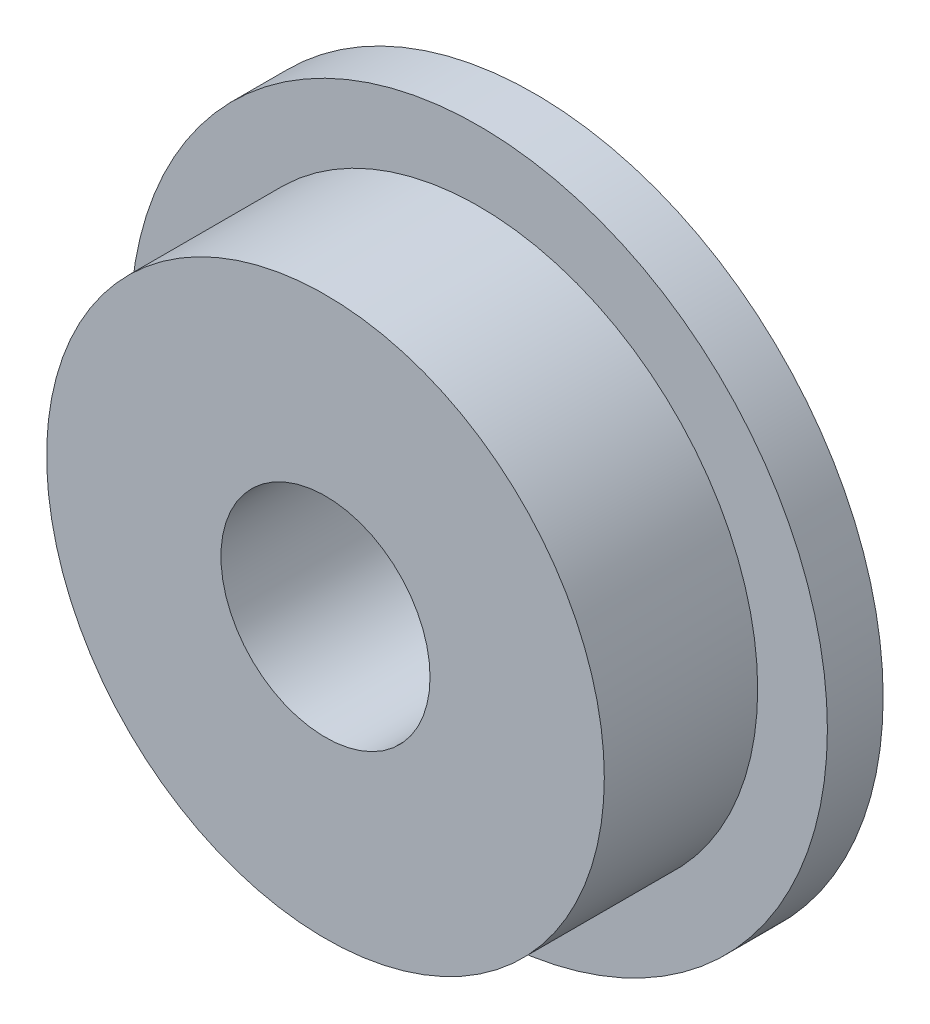
ISO-10303-21;
HEADER;
FILE_DESCRIPTION(('STEP AP214'),'2;1');
FILE_NAME('part.step','',(''),(''),'','','');
FILE_SCHEMA(('AUTOMOTIVE_DESIGN { 1 0 10303 214 1 1 1 1 }'));
ENDSEC;
DATA;
#1=APPLICATION_CONTEXT('core data for automotive mechanical design processes');
#2=APPLICATION_PROTOCOL_DEFINITION('international standard','automotive_design',2000,#1);
#3=PRODUCT_CONTEXT('',#1,'mechanical');
#4=PRODUCT('Part','Part','',(#3));
#5=PRODUCT_RELATED_PRODUCT_CATEGORY('part','',(#4));
#6=PRODUCT_DEFINITION_FORMATION('','',#4);
#7=PRODUCT_DEFINITION_CONTEXT('part definition',#1,'design');
#8=PRODUCT_DEFINITION('design','',#6,#7);
#9=PRODUCT_DEFINITION_SHAPE('','',#8);
#10=(LENGTH_UNIT() NAMED_UNIT(*) SI_UNIT(.MILLI.,.METRE.));
#11=(NAMED_UNIT(*) PLANE_ANGLE_UNIT() SI_UNIT($,.RADIAN.));
#12=(NAMED_UNIT(*) SI_UNIT($,.STERADIAN.) SOLID_ANGLE_UNIT());
#13=UNCERTAINTY_MEASURE_WITH_UNIT(LENGTH_MEASURE(1.E-05),#10,'distance_accuracy_value','');
#14=(GEOMETRIC_REPRESENTATION_CONTEXT(3) GLOBAL_UNCERTAINTY_ASSIGNED_CONTEXT((#13)) GLOBAL_UNIT_ASSIGNED_CONTEXT((#10,
#11,#12)) REPRESENTATION_CONTEXT('',''));
#15=CARTESIAN_POINT('',(0.,0.,0.));
#16=DIRECTION('',(0.,0.,1.));
#17=DIRECTION('',(1.,0.,0.));
#18=AXIS2_PLACEMENT_3D('',#15,#16,#17);
#19=CARTESIAN_POINT('',(0.,0.,0.4));
#20=DIRECTION('',(0.,0.,1.));
#21=DIRECTION('',(1.,0.,0.));
#22=AXIS2_PLACEMENT_3D('',#19,#20,#21);
#23=PLANE('',#22);
#24=CARTESIAN_POINT('',(0.,0.,0.4));
#25=DIRECTION('',(0.,0.,1.));
#26=DIRECTION('',(1.,0.,0.));
#27=AXIS2_PLACEMENT_3D('',#24,#25,#26);
#28=CIRCLE('',#27,2.);
#29=CARTESIAN_POINT('',(2.,0.,0.4));
#30=VERTEX_POINT('',#29);
#31=EDGE_CURVE('E10',#30,#30,#28,.T.);
#32=ORIENTED_EDGE('',*,*,#31,.F.);
#33=EDGE_LOOP('',(#32));
#34=FACE_BOUND('',#33,.T.);
#35=CARTESIAN_POINT('',(0.,0.,0.4));
#36=DIRECTION('',(0.,0.,1.));
#37=DIRECTION('',(1.,0.,0.));
#38=AXIS2_PLACEMENT_3D('',#35,#36,#37);
#39=CIRCLE('',#38,2.5);
#40=CARTESIAN_POINT('',(2.5,0.,0.4));
#41=VERTEX_POINT('',#40);
#42=EDGE_CURVE('E39',#41,#41,#39,.T.);
#43=ORIENTED_EDGE('',*,*,#42,.T.);
#44=EDGE_LOOP('',(#43));
#45=FACE_BOUND('',#44,.T.);
#46=ADVANCED_FACE('F31',(#34,#45),#23,.T.);
#47=CARTESIAN_POINT('',(0.,0.,0.));
#48=DIRECTION('',(0.,0.,1.));
#49=DIRECTION('',(1.,0.,0.));
#50=AXIS2_PLACEMENT_3D('',#47,#48,#49);
#51=PLANE('',#50);
#52=CARTESIAN_POINT('',(0.,0.,0.));
#53=DIRECTION('',(0.,0.,1.));
#54=DIRECTION('',(1.,0.,0.));
#55=AXIS2_PLACEMENT_3D('',#52,#53,#54);
#56=CIRCLE('',#55,2.5);
#57=CARTESIAN_POINT('',(2.5,0.,0.));
#58=VERTEX_POINT('',#57);
#59=EDGE_CURVE('E35',#58,#58,#56,.T.);
#60=ORIENTED_EDGE('',*,*,#59,.F.);
#61=EDGE_LOOP('',(#60));
#62=FACE_BOUND('',#61,.T.);
#63=CARTESIAN_POINT('',(0.,0.,0.));
#64=DIRECTION('',(0.,0.,1.));
#65=DIRECTION('',(1.,0.,0.));
#66=AXIS2_PLACEMENT_3D('',#63,#64,#65);
#67=CIRCLE('',#66,0.75);
#68=CARTESIAN_POINT('',(0.75,0.,0.));
#69=VERTEX_POINT('',#68);
#70=EDGE_CURVE('E48',#69,#69,#67,.T.);
#71=ORIENTED_EDGE('',*,*,#70,.T.);
#72=EDGE_LOOP('',(#71));
#73=FACE_BOUND('',#72,.T.);
#74=ADVANCED_FACE('F75',(#62,#73),#51,.F.);
#75=CARTESIAN_POINT('',(0.,0.,0.4));
#76=DIRECTION('',(0.,0.,-1.));
#77=DIRECTION('',(-1.,0.,0.));
#78=AXIS2_PLACEMENT_3D('',#75,#76,#77);
#79=CYLINDRICAL_SURFACE('',#78,2.5);
#80=ORIENTED_EDGE('',*,*,#42,.F.);
#81=EDGE_LOOP('',(#80));
#82=FACE_BOUND('',#81,.T.);
#83=ORIENTED_EDGE('',*,*,#59,.T.);
#84=EDGE_LOOP('',(#83));
#85=FACE_BOUND('',#84,.T.);
#86=ADVANCED_FACE('F33',(#82,#85),#79,.T.);
#87=CARTESIAN_POINT('',(0.,0.,0.4));
#88=DIRECTION('',(0.,0.,-1.));
#89=DIRECTION('',(-1.,0.,0.));
#90=AXIS2_PLACEMENT_3D('',#87,#88,#89);
#91=CYLINDRICAL_SURFACE('',#90,0.75);
#92=ORIENTED_EDGE('',*,*,#70,.F.);
#93=EDGE_LOOP('',(#92));
#94=FACE_BOUND('',#93,.T.);
#95=CARTESIAN_POINT('',(0.,0.,1.5));
#96=DIRECTION('',(0.,0.,1.));
#97=DIRECTION('',(1.,0.,0.));
#98=AXIS2_PLACEMENT_3D('',#95,#96,#97);
#99=CIRCLE('',#98,0.75);
#100=CARTESIAN_POINT('',(0.75,0.,1.5));
#101=VERTEX_POINT('',#100);
#102=EDGE_CURVE('E54',#101,#101,#99,.T.);
#103=ORIENTED_EDGE('',*,*,#102,.T.);
#104=EDGE_LOOP('',(#103));
#105=FACE_BOUND('',#104,.T.);
#106=ADVANCED_FACE('F60',(#94,#105),#91,.F.);
#107=CARTESIAN_POINT('',(0.,0.,1.5));
#108=DIRECTION('',(0.,0.,1.));
#109=DIRECTION('',(1.,0.,0.));
#110=AXIS2_PLACEMENT_3D('',#107,#108,#109);
#111=PLANE('',#110);
#112=CARTESIAN_POINT('',(0.,0.,1.5));
#113=DIRECTION('',(0.,0.,1.));
#114=DIRECTION('',(1.,0.,0.));
#115=AXIS2_PLACEMENT_3D('',#112,#113,#114);
#116=CIRCLE('',#115,2.);
#117=CARTESIAN_POINT('',(2.,0.,1.5));
#118=VERTEX_POINT('',#117);
#119=EDGE_CURVE('E46',#118,#118,#116,.T.);
#120=ORIENTED_EDGE('',*,*,#119,.T.);
#121=EDGE_LOOP('',(#120));
#122=FACE_BOUND('',#121,.T.);
#123=ORIENTED_EDGE('',*,*,#102,.F.);
#124=EDGE_LOOP('',(#123));
#125=FACE_BOUND('',#124,.T.);
#126=ADVANCED_FACE('F62',(#122,#125),#111,.T.);
#127=CARTESIAN_POINT('',(0.,0.,1.5));
#128=DIRECTION('',(0.,0.,-1.));
#129=DIRECTION('',(-1.,0.,0.));
#130=AXIS2_PLACEMENT_3D('',#127,#128,#129);
#131=CYLINDRICAL_SURFACE('',#130,2.);
#132=ORIENTED_EDGE('',*,*,#119,.F.);
#133=EDGE_LOOP('',(#132));
#134=FACE_BOUND('',#133,.T.);
#135=ORIENTED_EDGE('',*,*,#31,.T.);
#136=EDGE_LOOP('',(#135));
#137=FACE_BOUND('',#136,.T.);
#138=ADVANCED_FACE('F64',(#134,#137),#131,.T.);
#139=CLOSED_SHELL('',(#46,#74,#86,#106,#126,#138));
#140=MANIFOLD_SOLID_BREP('B2',#139);
#141=ADVANCED_BREP_SHAPE_REPRESENTATION('',(#18,#140),#14);
#142=SHAPE_DEFINITION_REPRESENTATION(#9,#141);
ENDSEC;
END-ISO-10303-21;
